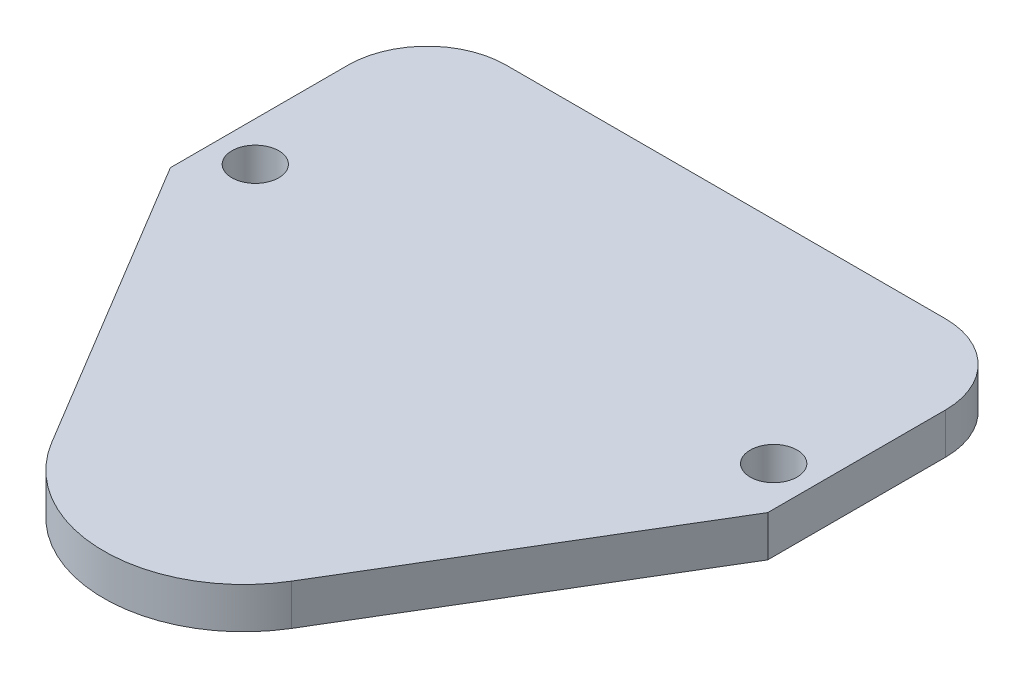
ISO-10303-21;
HEADER;
FILE_DESCRIPTION(('STEP AP214'),'2;1');
FILE_NAME('part.step','',(''),(''),'','','');
FILE_SCHEMA(('AUTOMOTIVE_DESIGN { 1 0 10303 214 1 1 1 1 }'));
ENDSEC;
DATA;
#1=APPLICATION_CONTEXT('core data for automotive mechanical design processes');
#2=APPLICATION_PROTOCOL_DEFINITION('international standard','automotive_design',2000,#1);
#3=PRODUCT_CONTEXT('',#1,'mechanical');
#4=PRODUCT('Part','Part','',(#3));
#5=PRODUCT_RELATED_PRODUCT_CATEGORY('part','',(#4));
#6=PRODUCT_DEFINITION_FORMATION('','',#4);
#7=PRODUCT_DEFINITION_CONTEXT('part definition',#1,'design');
#8=PRODUCT_DEFINITION('design','',#6,#7);
#9=PRODUCT_DEFINITION_SHAPE('','',#8);
#10=(LENGTH_UNIT() NAMED_UNIT(*) SI_UNIT(.MILLI.,.METRE.));
#11=(NAMED_UNIT(*) PLANE_ANGLE_UNIT() SI_UNIT($,.RADIAN.));
#12=(NAMED_UNIT(*) SI_UNIT($,.STERADIAN.) SOLID_ANGLE_UNIT());
#13=UNCERTAINTY_MEASURE_WITH_UNIT(LENGTH_MEASURE(1.E-05),#10,'distance_accuracy_value','');
#14=(GEOMETRIC_REPRESENTATION_CONTEXT(3) GLOBAL_UNCERTAINTY_ASSIGNED_CONTEXT((#13)) GLOBAL_UNIT_ASSIGNED_CONTEXT((#10,
#11,#12)) REPRESENTATION_CONTEXT('',''));
#15=CARTESIAN_POINT('',(0.,0.,0.));
#16=DIRECTION('',(0.,0.,1.));
#17=DIRECTION('',(1.,0.,0.));
#18=AXIS2_PLACEMENT_3D('',#15,#16,#17);
#19=CARTESIAN_POINT('',(0.,4.15,17.3279553115594));
#20=DIRECTION('',(0.,1.,0.));
#21=DIRECTION('',(0.,0.,1.));
#22=AXIS2_PLACEMENT_3D('',#19,#20,#21);
#23=PLANE('',#22);
#24=CARTESIAN_POINT('',(26.25,4.15,-10.1));
#25=DIRECTION('',(0.,1.,0.));
#26=DIRECTION('',(0.,0.,1.));
#27=AXIS2_PLACEMENT_3D('',#24,#25,#26);
#28=CIRCLE('',#27,2.375);
#29=CARTESIAN_POINT('',(26.25,4.15,-12.475));
#30=VERTEX_POINT('',#29);
#31=EDGE_CURVE('E137',#30,#30,#28,.T.);
#32=ORIENTED_EDGE('',*,*,#31,.F.);
#33=EDGE_LOOP('',(#32));
#34=FACE_BOUND('',#33,.T.);
#35=CARTESIAN_POINT('',(0.,4.15,17.3279553115594));
#36=DIRECTION('',(0.,1.,0.));
#37=DIRECTION('',(0.,0.,1.));
#38=AXIS2_PLACEMENT_3D('',#35,#36,#37);
#39=CIRCLE('',#38,14.1720446884405);
#40=CARTESIAN_POINT('',(-12.1478132910203,4.15,24.6270979254331));
#41=VERTEX_POINT('',#40);
#42=CARTESIAN_POINT('',(12.1478132910203,4.15,24.6270979254331));
#43=VERTEX_POINT('',#42);
#44=EDGE_CURVE('E148',#41,#43,#39,.T.);
#45=ORIENTED_EDGE('',*,*,#44,.T.);
#46=DIRECTION('',(0.515038074910055,0.,-0.857167300702112));
#47=VECTOR('',#46,1.);
#48=CARTESIAN_POINT('',(30.25,4.15,-5.5));
#49=LINE('',#48,#47);
#50=CARTESIAN_POINT('',(30.25,4.15,-5.5));
#51=VERTEX_POINT('',#50);
#52=EDGE_CURVE('E96',#43,#51,#49,.T.);
#53=ORIENTED_EDGE('',*,*,#52,.T.);
#54=DIRECTION('',(0.,0.,-1.));
#55=VECTOR('',#54,1.);
#56=CARTESIAN_POINT('',(30.25,4.15,-23.4999999999999));
#57=LINE('',#56,#55);
#58=CARTESIAN_POINT('',(30.25,4.15,-23.4999999999999));
#59=VERTEX_POINT('',#58);
#60=EDGE_CURVE('E163',#51,#59,#57,.T.);
#61=ORIENTED_EDGE('',*,*,#60,.T.);
#62=CARTESIAN_POINT('',(22.25,4.15,-23.5));
#63=DIRECTION('',(0.,1.,0.));
#64=DIRECTION('',(0.,0.,1.));
#65=AXIS2_PLACEMENT_3D('',#62,#63,#64);
#66=CIRCLE('',#65,8.);
#67=CARTESIAN_POINT('',(22.2499999999999,4.15,-31.5));
#68=VERTEX_POINT('',#67);
#69=EDGE_CURVE('E176',#59,#68,#66,.T.);
#70=ORIENTED_EDGE('',*,*,#69,.T.);
#71=DIRECTION('',(-1.,0.,0.));
#72=VECTOR('',#71,1.);
#73=CARTESIAN_POINT('',(-22.2499999999999,4.15,-31.5));
#74=LINE('',#73,#72);
#75=CARTESIAN_POINT('',(-22.25,4.15,-31.5));
#76=VERTEX_POINT('',#75);
#77=EDGE_CURVE('E115',#68,#76,#74,.T.);
#78=ORIENTED_EDGE('',*,*,#77,.T.);
#79=CARTESIAN_POINT('',(-22.25,4.15,-23.5));
#80=DIRECTION('',(0.,1.,0.));
#81=DIRECTION('',(0.,0.,-1.));
#82=AXIS2_PLACEMENT_3D('',#79,#80,#81);
#83=CIRCLE('',#82,8.);
#84=CARTESIAN_POINT('',(-30.25,4.15,-23.4999999999999));
#85=VERTEX_POINT('',#84);
#86=EDGE_CURVE('E109',#76,#85,#83,.T.);
#87=ORIENTED_EDGE('',*,*,#86,.T.);
#88=DIRECTION('',(0.,0.,1.));
#89=VECTOR('',#88,1.);
#90=CARTESIAN_POINT('',(-30.25,4.15,-23.4999999999999));
#91=LINE('',#90,#89);
#92=CARTESIAN_POINT('',(-30.25,4.15,-5.5));
#93=VERTEX_POINT('',#92);
#94=EDGE_CURVE('E113',#85,#93,#91,.T.);
#95=ORIENTED_EDGE('',*,*,#94,.T.);
#96=DIRECTION('',(0.515038074910055,0.,0.857167300702112));
#97=VECTOR('',#96,1.);
#98=CARTESIAN_POINT('',(-30.25,4.15,-5.5));
#99=LINE('',#98,#97);
#100=EDGE_CURVE('E53',#93,#41,#99,.T.);
#101=ORIENTED_EDGE('',*,*,#100,.T.);
#102=EDGE_LOOP('',(#45,#53,#61,#70,#78,#87,#95,#101));
#103=FACE_BOUND('',#102,.T.);
#104=CARTESIAN_POINT('',(-26.25,4.15,-10.1));
#105=DIRECTION('',(0.,1.,0.));
#106=DIRECTION('',(0.,0.,-1.));
#107=AXIS2_PLACEMENT_3D('',#104,#105,#106);
#108=CIRCLE('',#107,2.375);
#109=CARTESIAN_POINT('',(-26.25,4.15,-12.475));
#110=VERTEX_POINT('',#109);
#111=EDGE_CURVE('E185',#110,#110,#108,.T.);
#112=ORIENTED_EDGE('',*,*,#111,.F.);
#113=EDGE_LOOP('',(#112));
#114=FACE_BOUND('',#113,.T.);
#115=ADVANCED_FACE('F36',(#34,#103,#114),#23,.T.);
#116=CARTESIAN_POINT('',(0.,0.,17.3279553115594));
#117=DIRECTION('',(0.,1.,0.));
#118=DIRECTION('',(0.,0.,1.));
#119=AXIS2_PLACEMENT_3D('',#116,#117,#118);
#120=PLANE('',#119);
#121=CARTESIAN_POINT('',(0.,0.,17.3279553115594));
#122=DIRECTION('',(0.,1.,0.));
#123=DIRECTION('',(0.,0.,1.));
#124=AXIS2_PLACEMENT_3D('',#121,#122,#123);
#125=CIRCLE('',#124,14.1720446884405);
#126=CARTESIAN_POINT('',(-12.1478132910203,0.,24.6270979254331));
#127=VERTEX_POINT('',#126);
#128=CARTESIAN_POINT('',(12.1478132910203,0.,24.6270979254331));
#129=VERTEX_POINT('',#128);
#130=EDGE_CURVE('E133',#127,#129,#125,.T.);
#131=ORIENTED_EDGE('',*,*,#130,.F.);
#132=DIRECTION('',(0.515038074910055,0.,0.857167300702112));
#133=VECTOR('',#132,1.);
#134=CARTESIAN_POINT('',(-30.25,0.,-5.5));
#135=LINE('',#134,#133);
#136=CARTESIAN_POINT('',(-30.25,0.,-5.5));
#137=VERTEX_POINT('',#136);
#138=EDGE_CURVE('E88',#137,#127,#135,.T.);
#139=ORIENTED_EDGE('',*,*,#138,.F.);
#140=DIRECTION('',(0.,0.,1.));
#141=VECTOR('',#140,1.);
#142=CARTESIAN_POINT('',(-30.25,0.,-23.4999999999999));
#143=LINE('',#142,#141);
#144=CARTESIAN_POINT('',(-30.25,0.,-23.4999999999999));
#145=VERTEX_POINT('',#144);
#146=EDGE_CURVE('E82',#145,#137,#143,.T.);
#147=ORIENTED_EDGE('',*,*,#146,.F.);
#148=CARTESIAN_POINT('',(-22.25,0.,-23.5));
#149=DIRECTION('',(0.,1.,0.));
#150=DIRECTION('',(0.,0.,-1.));
#151=AXIS2_PLACEMENT_3D('',#148,#149,#150);
#152=CIRCLE('',#151,8.);
#153=CARTESIAN_POINT('',(-22.25,0.,-31.5));
#154=VERTEX_POINT('',#153);
#155=EDGE_CURVE('E123',#154,#145,#152,.T.);
#156=ORIENTED_EDGE('',*,*,#155,.F.);
#157=DIRECTION('',(-1.,0.,0.));
#158=VECTOR('',#157,1.);
#159=CARTESIAN_POINT('',(-22.2499999999999,0.,-31.5));
#160=LINE('',#159,#158);
#161=CARTESIAN_POINT('',(22.2499999999999,0.,-31.5));
#162=VERTEX_POINT('',#161);
#163=EDGE_CURVE('E143',#162,#154,#160,.T.);
#164=ORIENTED_EDGE('',*,*,#163,.F.);
#165=CARTESIAN_POINT('',(22.25,0.,-23.5));
#166=DIRECTION('',(0.,1.,0.));
#167=DIRECTION('',(0.,0.,1.));
#168=AXIS2_PLACEMENT_3D('',#165,#166,#167);
#169=CIRCLE('',#168,8.);
#170=CARTESIAN_POINT('',(30.25,0.,-23.4999999999999));
#171=VERTEX_POINT('',#170);
#172=EDGE_CURVE('E141',#171,#162,#169,.T.);
#173=ORIENTED_EDGE('',*,*,#172,.F.);
#174=DIRECTION('',(0.,0.,-1.));
#175=VECTOR('',#174,1.);
#176=CARTESIAN_POINT('',(30.25,0.,-23.4999999999999));
#177=LINE('',#176,#175);
#178=CARTESIAN_POINT('',(30.25,0.,-5.5));
#179=VERTEX_POINT('',#178);
#180=EDGE_CURVE('E139',#179,#171,#177,.T.);
#181=ORIENTED_EDGE('',*,*,#180,.F.);
#182=DIRECTION('',(0.515038074910055,0.,-0.857167300702112));
#183=VECTOR('',#182,1.);
#184=CARTESIAN_POINT('',(30.25,0.,-5.5));
#185=LINE('',#184,#183);
#186=EDGE_CURVE('E136',#129,#179,#185,.T.);
#187=ORIENTED_EDGE('',*,*,#186,.F.);
#188=EDGE_LOOP('',(#131,#139,#147,#156,#164,#173,#181,#187));
#189=FACE_BOUND('',#188,.T.);
#190=CARTESIAN_POINT('',(26.25,0.,-10.1));
#191=DIRECTION('',(0.,1.,0.));
#192=DIRECTION('',(0.,0.,1.));
#193=AXIS2_PLACEMENT_3D('',#190,#191,#192);
#194=CIRCLE('',#193,2.375);
#195=CARTESIAN_POINT('',(26.25,0.,-12.475));
#196=VERTEX_POINT('',#195);
#197=EDGE_CURVE('E182',#196,#196,#194,.T.);
#198=ORIENTED_EDGE('',*,*,#197,.T.);
#199=EDGE_LOOP('',(#198));
#200=FACE_BOUND('',#199,.T.);
#201=CARTESIAN_POINT('',(-26.25,0.,-10.1));
#202=DIRECTION('',(0.,1.,0.));
#203=DIRECTION('',(0.,0.,-1.));
#204=AXIS2_PLACEMENT_3D('',#201,#202,#203);
#205=CIRCLE('',#204,2.375);
#206=CARTESIAN_POINT('',(-26.25,0.,-12.475));
#207=VERTEX_POINT('',#206);
#208=EDGE_CURVE('E188',#207,#207,#205,.T.);
#209=ORIENTED_EDGE('',*,*,#208,.T.);
#210=EDGE_LOOP('',(#209));
#211=FACE_BOUND('',#210,.T.);
#212=ADVANCED_FACE('F167',(#189,#200,#211),#120,.F.);
#213=CARTESIAN_POINT('',(0.,4.15,17.3279553115594));
#214=DIRECTION('',(0.,-1.,0.));
#215=DIRECTION('',(0.,0.,-1.));
#216=AXIS2_PLACEMENT_3D('',#213,#214,#215);
#217=CYLINDRICAL_SURFACE('',#216,14.1720446884405);
#218=ORIENTED_EDGE('',*,*,#130,.T.);
#219=DIRECTION('',(0.,-1.,0.));
#220=VECTOR('',#219,1.);
#221=CARTESIAN_POINT('',(12.1478132910203,4.15,24.6270979254331));
#222=LINE('',#221,#220);
#223=EDGE_CURVE('E11',#43,#129,#222,.T.);
#224=ORIENTED_EDGE('',*,*,#223,.F.);
#225=ORIENTED_EDGE('',*,*,#44,.F.);
#226=DIRECTION('',(0.,-1.,0.));
#227=VECTOR('',#226,1.);
#228=CARTESIAN_POINT('',(-12.1478132910203,4.15,24.6270979254331));
#229=LINE('',#228,#227);
#230=EDGE_CURVE('E129',#41,#127,#229,.T.);
#231=ORIENTED_EDGE('',*,*,#230,.T.);
#232=EDGE_LOOP('',(#218,#224,#225,#231));
#233=FACE_BOUND('',#232,.T.);
#234=ADVANCED_FACE('F38',(#233),#217,.T.);
#235=CARTESIAN_POINT('',(30.25,4.15,-5.5));
#236=DIRECTION('',(-0.857167300702112,0.,-0.515038074910055));
#237=DIRECTION('',(-0.515038074910055,0.,0.857167300702112));
#238=AXIS2_PLACEMENT_3D('',#235,#236,#237);
#239=PLANE('',#238);
#240=ORIENTED_EDGE('',*,*,#186,.T.);
#241=DIRECTION('',(0.,-1.,0.));
#242=VECTOR('',#241,1.);
#243=CARTESIAN_POINT('',(30.25,4.15,-5.5));
#244=LINE('',#243,#242);
#245=EDGE_CURVE('E45',#51,#179,#244,.T.);
#246=ORIENTED_EDGE('',*,*,#245,.F.);
#247=ORIENTED_EDGE('',*,*,#52,.F.);
#248=ORIENTED_EDGE('',*,*,#223,.T.);
#249=EDGE_LOOP('',(#240,#246,#247,#248));
#250=FACE_BOUND('',#249,.T.);
#251=ADVANCED_FACE('F220',(#250),#239,.F.);
#252=CARTESIAN_POINT('',(30.25,4.15,-23.4999999999999));
#253=DIRECTION('',(-1.,0.,0.));
#254=DIRECTION('',(0.,0.,1.));
#255=AXIS2_PLACEMENT_3D('',#252,#253,#254);
#256=PLANE('',#255);
#257=ORIENTED_EDGE('',*,*,#180,.T.);
#258=DIRECTION('',(0.,-1.,0.));
#259=VECTOR('',#258,1.);
#260=CARTESIAN_POINT('',(30.25,4.15,-23.4999999999999));
#261=LINE('',#260,#259);
#262=EDGE_CURVE('E155',#59,#171,#261,.T.);
#263=ORIENTED_EDGE('',*,*,#262,.F.);
#264=ORIENTED_EDGE('',*,*,#60,.F.);
#265=ORIENTED_EDGE('',*,*,#245,.T.);
#266=EDGE_LOOP('',(#257,#263,#264,#265));
#267=FACE_BOUND('',#266,.T.);
#268=ADVANCED_FACE('F161',(#267),#256,.F.);
#269=CARTESIAN_POINT('',(22.25,4.15,-23.5));
#270=DIRECTION('',(0.,-1.,0.));
#271=DIRECTION('',(0.,0.,-1.));
#272=AXIS2_PLACEMENT_3D('',#269,#270,#271);
#273=CYLINDRICAL_SURFACE('',#272,8.);
#274=ORIENTED_EDGE('',*,*,#172,.T.);
#275=DIRECTION('',(0.,-1.,0.));
#276=VECTOR('',#275,1.);
#277=CARTESIAN_POINT('',(22.2499999999999,4.15,-31.5));
#278=LINE('',#277,#276);
#279=EDGE_CURVE('E152',#68,#162,#278,.T.);
#280=ORIENTED_EDGE('',*,*,#279,.F.);
#281=ORIENTED_EDGE('',*,*,#69,.F.);
#282=ORIENTED_EDGE('',*,*,#262,.T.);
#283=EDGE_LOOP('',(#274,#280,#281,#282));
#284=FACE_BOUND('',#283,.T.);
#285=ADVANCED_FACE('F172',(#284),#273,.T.);
#286=CARTESIAN_POINT('',(-22.2499999999999,4.15,-31.5));
#287=DIRECTION('',(0.,0.,1.));
#288=DIRECTION('',(1.,0.,0.));
#289=AXIS2_PLACEMENT_3D('',#286,#287,#288);
#290=PLANE('',#289);
#291=ORIENTED_EDGE('',*,*,#163,.T.);
#292=DIRECTION('',(0.,-1.,0.));
#293=VECTOR('',#292,1.);
#294=CARTESIAN_POINT('',(-22.25,4.15,-31.5));
#295=LINE('',#294,#293);
#296=EDGE_CURVE('E124',#76,#154,#295,.T.);
#297=ORIENTED_EDGE('',*,*,#296,.F.);
#298=ORIENTED_EDGE('',*,*,#77,.F.);
#299=ORIENTED_EDGE('',*,*,#279,.T.);
#300=EDGE_LOOP('',(#291,#297,#298,#299));
#301=FACE_BOUND('',#300,.T.);
#302=ADVANCED_FACE('F175',(#301),#290,.F.);
#303=CARTESIAN_POINT('',(-22.25,4.15,-23.5));
#304=DIRECTION('',(0.,-1.,0.));
#305=DIRECTION('',(0.,0.,-1.));
#306=AXIS2_PLACEMENT_3D('',#303,#304,#305);
#307=CYLINDRICAL_SURFACE('',#306,8.);
#308=ORIENTED_EDGE('',*,*,#155,.T.);
#309=DIRECTION('',(0.,-1.,0.));
#310=VECTOR('',#309,1.);
#311=CARTESIAN_POINT('',(-30.25,4.15,-23.4999999999999));
#312=LINE('',#311,#310);
#313=EDGE_CURVE('E120',#85,#145,#312,.T.);
#314=ORIENTED_EDGE('',*,*,#313,.F.);
#315=ORIENTED_EDGE('',*,*,#86,.F.);
#316=ORIENTED_EDGE('',*,*,#296,.T.);
#317=EDGE_LOOP('',(#308,#314,#315,#316));
#318=FACE_BOUND('',#317,.T.);
#319=ADVANCED_FACE('F121',(#318),#307,.T.);
#320=CARTESIAN_POINT('',(-30.25,4.15,-23.4999999999999));
#321=DIRECTION('',(1.,0.,0.));
#322=DIRECTION('',(0.,0.,-1.));
#323=AXIS2_PLACEMENT_3D('',#320,#321,#322);
#324=PLANE('',#323);
#325=ORIENTED_EDGE('',*,*,#146,.T.);
#326=DIRECTION('',(0.,-1.,0.));
#327=VECTOR('',#326,1.);
#328=CARTESIAN_POINT('',(-30.25,4.15,-5.5));
#329=LINE('',#328,#327);
#330=EDGE_CURVE('E125',#93,#137,#329,.T.);
#331=ORIENTED_EDGE('',*,*,#330,.F.);
#332=ORIENTED_EDGE('',*,*,#94,.F.);
#333=ORIENTED_EDGE('',*,*,#313,.T.);
#334=EDGE_LOOP('',(#325,#331,#332,#333));
#335=FACE_BOUND('',#334,.T.);
#336=ADVANCED_FACE('F127',(#335),#324,.F.);
#337=CARTESIAN_POINT('',(-30.25,4.15,-5.5));
#338=DIRECTION('',(0.857167300702112,0.,-0.515038074910055));
#339=DIRECTION('',(-0.515038074910055,0.,-0.857167300702112));
#340=AXIS2_PLACEMENT_3D('',#337,#338,#339);
#341=PLANE('',#340);
#342=ORIENTED_EDGE('',*,*,#138,.T.);
#343=ORIENTED_EDGE('',*,*,#230,.F.);
#344=ORIENTED_EDGE('',*,*,#100,.F.);
#345=ORIENTED_EDGE('',*,*,#330,.T.);
#346=EDGE_LOOP('',(#342,#343,#344,#345));
#347=FACE_BOUND('',#346,.T.);
#348=ADVANCED_FACE('F208',(#347),#341,.F.);
#349=CARTESIAN_POINT('',(26.25,4.15,-10.1));
#350=DIRECTION('',(0.,-1.,0.));
#351=DIRECTION('',(0.,0.,-1.));
#352=AXIS2_PLACEMENT_3D('',#349,#350,#351);
#353=CYLINDRICAL_SURFACE('',#352,2.375);
#354=CARTESIAN_POINT('',(26.25,4.15,-12.475));
#355=CARTESIAN_POINT('',(26.25,4.10677083333333,-12.475));
#356=CARTESIAN_POINT('',(26.25,4.06354166666667,-12.475));
#357=CARTESIAN_POINT('',(26.25,3.97708333333333,-12.475));
#358=CARTESIAN_POINT('',(26.25,3.93385416666667,-12.475));
#359=CARTESIAN_POINT('',(26.25,3.84739583333333,-12.475));
#360=CARTESIAN_POINT('',(26.25,3.80416666666667,-12.475));
#361=CARTESIAN_POINT('',(26.25,3.71770833333333,-12.475));
#362=CARTESIAN_POINT('',(26.25,3.67447916666667,-12.475));
#363=CARTESIAN_POINT('',(26.25,3.58802083333333,-12.475));
#364=CARTESIAN_POINT('',(26.25,3.54479166666667,-12.475));
#365=CARTESIAN_POINT('',(26.25,3.45833333333333,-12.475));
#366=CARTESIAN_POINT('',(26.25,3.41510416666667,-12.475));
#367=CARTESIAN_POINT('',(26.25,3.32864583333333,-12.475));
#368=CARTESIAN_POINT('',(26.25,3.28541666666667,-12.475));
#369=CARTESIAN_POINT('',(26.25,3.19895833333333,-12.475));
#370=CARTESIAN_POINT('',(26.25,3.15572916666667,-12.475));
#371=CARTESIAN_POINT('',(26.25,3.06927083333333,-12.475));
#372=CARTESIAN_POINT('',(26.25,3.02604166666667,-12.475));
#373=CARTESIAN_POINT('',(26.25,2.93958333333333,-12.475));
#374=CARTESIAN_POINT('',(26.25,2.89635416666667,-12.475));
#375=CARTESIAN_POINT('',(26.25,2.80989583333333,-12.475));
#376=CARTESIAN_POINT('',(26.25,2.76666666666667,-12.475));
#377=CARTESIAN_POINT('',(26.25,2.68020833333333,-12.475));
#378=CARTESIAN_POINT('',(26.25,2.63697916666667,-12.475));
#379=CARTESIAN_POINT('',(26.25,2.55052083333333,-12.475));
#380=CARTESIAN_POINT('',(26.25,2.50729166666667,-12.475));
#381=CARTESIAN_POINT('',(26.25,2.42083333333333,-12.475));
#382=CARTESIAN_POINT('',(26.25,2.37760416666667,-12.475));
#383=CARTESIAN_POINT('',(26.25,2.29114583333333,-12.475));
#384=CARTESIAN_POINT('',(26.25,2.24791666666667,-12.475));
#385=CARTESIAN_POINT('',(26.25,2.16145833333333,-12.475));
#386=CARTESIAN_POINT('',(26.25,2.11822916666667,-12.475));
#387=CARTESIAN_POINT('',(26.25,2.03177083333333,-12.475));
#388=CARTESIAN_POINT('',(26.25,1.98854166666667,-12.475));
#389=CARTESIAN_POINT('',(26.25,1.90208333333333,-12.475));
#390=CARTESIAN_POINT('',(26.25,1.85885416666667,-12.475));
#391=CARTESIAN_POINT('',(26.25,1.77239583333333,-12.475));
#392=CARTESIAN_POINT('',(26.25,1.72916666666667,-12.475));
#393=CARTESIAN_POINT('',(26.25,1.64270833333333,-12.475));
#394=CARTESIAN_POINT('',(26.25,1.59947916666667,-12.475));
#395=CARTESIAN_POINT('',(26.25,1.51302083333333,-12.475));
#396=CARTESIAN_POINT('',(26.25,1.46979166666667,-12.475));
#397=CARTESIAN_POINT('',(26.25,1.38333333333333,-12.475));
#398=CARTESIAN_POINT('',(26.25,1.34010416666667,-12.475));
#399=CARTESIAN_POINT('',(26.25,1.25364583333333,-12.475));
#400=CARTESIAN_POINT('',(26.25,1.21041666666667,-12.475));
#401=CARTESIAN_POINT('',(26.25,1.12395833333333,-12.475));
#402=CARTESIAN_POINT('',(26.25,1.08072916666667,-12.475));
#403=CARTESIAN_POINT('',(26.25,0.994270833333334,-12.475));
#404=CARTESIAN_POINT('',(26.25,0.951041666666667,-12.475));
#405=CARTESIAN_POINT('',(26.25,0.864583333333333,-12.475));
#406=CARTESIAN_POINT('',(26.25,0.821354166666667,-12.475));
#407=CARTESIAN_POINT('',(26.25,0.734895833333334,-12.475));
#408=CARTESIAN_POINT('',(26.25,0.691666666666667,-12.475));
#409=CARTESIAN_POINT('',(26.25,0.605208333333333,-12.475));
#410=CARTESIAN_POINT('',(26.25,0.561979166666667,-12.475));
#411=CARTESIAN_POINT('',(26.25,0.475520833333333,-12.475));
#412=CARTESIAN_POINT('',(26.25,0.432291666666667,-12.475));
#413=CARTESIAN_POINT('',(26.25,0.345833333333333,-12.475));
#414=CARTESIAN_POINT('',(26.25,0.302604166666667,-12.475));
#415=CARTESIAN_POINT('',(26.25,0.216145833333333,-12.475));
#416=CARTESIAN_POINT('',(26.25,0.172916666666666,-12.475));
#417=CARTESIAN_POINT('',(26.25,0.0864583333333331,-12.475));
#418=CARTESIAN_POINT('',(26.25,0.0432291666666665,-12.475));
#419=CARTESIAN_POINT('',(26.25,0.,-12.475));
#420=B_SPLINE_CURVE_WITH_KNOTS('',3,(#354,#355,#356,#357,#358,#359,#360,#361,#362,#363,#364,
#365,#366,#367,#368,#369,#370,#371,#372,#373,#374,#375,#376,#377,#378,#379,#380,#381,#382,#383,
#384,#385,#386,#387,#388,#389,#390,#391,#392,#393,#394,#395,#396,#397,#398,#399,#400,#401,#402,
#403,#404,#405,#406,#407,#408,#409,#410,#411,#412,#413,#414,#415,#416,#417,#418,#419),
.UNSPECIFIED.,.F.,.F.,(4,2,2,2,2,2,2,2,2,2,2,2,2,2,2,2,2,2,2,2,2,2,2,2,2,2,2,2,2,2,2,2,4),(0.,
0.1296875,0.259375,0.3890625,0.518749999999999,0.6484375,0.778124999999999,0.907812499999999,
1.0375,1.1671875,1.296875,1.4265625,1.55625,1.6859375,1.815625,1.9453125,2.075,2.2046875,
2.334375,2.4640625,2.59375,2.7234375,2.853125,2.9828125,3.1125,3.2421875,3.371875,3.5015625,
3.63125,3.7609375,3.890625,4.0203125,4.15),.UNSPECIFIED.);
#421=EDGE_CURVE('BSEAM205',#30,#196,#420,.T.);
#422=ORIENTED_EDGE('',*,*,#31,.T.);
#423=ORIENTED_EDGE('',*,*,#197,.F.);
#424=ORIENTED_EDGE('',*,*,#421,.T.);
#425=ORIENTED_EDGE('',*,*,#421,.F.);
#426=EDGE_LOOP('',(#422,#424,#423,#425));
#427=FACE_BOUND('',#426,.T.);
#428=ADVANCED_FACE('F205',(#427),#353,.F.);
#429=CARTESIAN_POINT('',(-26.25,4.15,-10.1));
#430=DIRECTION('',(0.,-1.,0.));
#431=DIRECTION('',(0.,0.,-1.));
#432=AXIS2_PLACEMENT_3D('',#429,#430,#431);
#433=CYLINDRICAL_SURFACE('',#432,2.375);
#434=CARTESIAN_POINT('',(-26.25,4.15,-12.475));
#435=CARTESIAN_POINT('',(-26.25,4.10677083333333,-12.475));
#436=CARTESIAN_POINT('',(-26.25,4.06354166666667,-12.475));
#437=CARTESIAN_POINT('',(-26.25,3.97708333333333,-12.475));
#438=CARTESIAN_POINT('',(-26.25,3.93385416666667,-12.475));
#439=CARTESIAN_POINT('',(-26.25,3.84739583333333,-12.475));
#440=CARTESIAN_POINT('',(-26.25,3.80416666666667,-12.475));
#441=CARTESIAN_POINT('',(-26.25,3.71770833333333,-12.475));
#442=CARTESIAN_POINT('',(-26.25,3.67447916666667,-12.475));
#443=CARTESIAN_POINT('',(-26.25,3.58802083333333,-12.475));
#444=CARTESIAN_POINT('',(-26.25,3.54479166666667,-12.475));
#445=CARTESIAN_POINT('',(-26.25,3.45833333333333,-12.475));
#446=CARTESIAN_POINT('',(-26.25,3.41510416666667,-12.475));
#447=CARTESIAN_POINT('',(-26.25,3.32864583333333,-12.475));
#448=CARTESIAN_POINT('',(-26.25,3.28541666666667,-12.475));
#449=CARTESIAN_POINT('',(-26.25,3.19895833333333,-12.475));
#450=CARTESIAN_POINT('',(-26.25,3.15572916666667,-12.475));
#451=CARTESIAN_POINT('',(-26.25,3.06927083333333,-12.475));
#452=CARTESIAN_POINT('',(-26.25,3.02604166666667,-12.475));
#453=CARTESIAN_POINT('',(-26.25,2.93958333333333,-12.475));
#454=CARTESIAN_POINT('',(-26.25,2.89635416666667,-12.475));
#455=CARTESIAN_POINT('',(-26.25,2.80989583333333,-12.475));
#456=CARTESIAN_POINT('',(-26.25,2.76666666666667,-12.475));
#457=CARTESIAN_POINT('',(-26.25,2.68020833333333,-12.475));
#458=CARTESIAN_POINT('',(-26.25,2.63697916666667,-12.475));
#459=CARTESIAN_POINT('',(-26.25,2.55052083333333,-12.475));
#460=CARTESIAN_POINT('',(-26.25,2.50729166666667,-12.475));
#461=CARTESIAN_POINT('',(-26.25,2.42083333333333,-12.475));
#462=CARTESIAN_POINT('',(-26.25,2.37760416666667,-12.475));
#463=CARTESIAN_POINT('',(-26.25,2.29114583333333,-12.475));
#464=CARTESIAN_POINT('',(-26.25,2.24791666666667,-12.475));
#465=CARTESIAN_POINT('',(-26.25,2.16145833333333,-12.475));
#466=CARTESIAN_POINT('',(-26.25,2.11822916666667,-12.475));
#467=CARTESIAN_POINT('',(-26.25,2.03177083333333,-12.475));
#468=CARTESIAN_POINT('',(-26.25,1.98854166666667,-12.475));
#469=CARTESIAN_POINT('',(-26.25,1.90208333333333,-12.475));
#470=CARTESIAN_POINT('',(-26.25,1.85885416666667,-12.475));
#471=CARTESIAN_POINT('',(-26.25,1.77239583333333,-12.475));
#472=CARTESIAN_POINT('',(-26.25,1.72916666666667,-12.475));
#473=CARTESIAN_POINT('',(-26.25,1.64270833333333,-12.475));
#474=CARTESIAN_POINT('',(-26.25,1.59947916666667,-12.475));
#475=CARTESIAN_POINT('',(-26.25,1.51302083333333,-12.475));
#476=CARTESIAN_POINT('',(-26.25,1.46979166666667,-12.475));
#477=CARTESIAN_POINT('',(-26.25,1.38333333333333,-12.475));
#478=CARTESIAN_POINT('',(-26.25,1.34010416666667,-12.475));
#479=CARTESIAN_POINT('',(-26.25,1.25364583333333,-12.475));
#480=CARTESIAN_POINT('',(-26.25,1.21041666666667,-12.475));
#481=CARTESIAN_POINT('',(-26.25,1.12395833333333,-12.475));
#482=CARTESIAN_POINT('',(-26.25,1.08072916666667,-12.475));
#483=CARTESIAN_POINT('',(-26.25,0.994270833333334,-12.475));
#484=CARTESIAN_POINT('',(-26.25,0.951041666666667,-12.475));
#485=CARTESIAN_POINT('',(-26.25,0.864583333333333,-12.475));
#486=CARTESIAN_POINT('',(-26.25,0.821354166666667,-12.475));
#487=CARTESIAN_POINT('',(-26.25,0.734895833333334,-12.475));
#488=CARTESIAN_POINT('',(-26.25,0.691666666666667,-12.475));
#489=CARTESIAN_POINT('',(-26.25,0.605208333333333,-12.475));
#490=CARTESIAN_POINT('',(-26.25,0.561979166666667,-12.475));
#491=CARTESIAN_POINT('',(-26.25,0.475520833333333,-12.475));
#492=CARTESIAN_POINT('',(-26.25,0.432291666666667,-12.475));
#493=CARTESIAN_POINT('',(-26.25,0.345833333333333,-12.475));
#494=CARTESIAN_POINT('',(-26.25,0.302604166666667,-12.475));
#495=CARTESIAN_POINT('',(-26.25,0.216145833333333,-12.475));
#496=CARTESIAN_POINT('',(-26.25,0.172916666666666,-12.475));
#497=CARTESIAN_POINT('',(-26.25,0.0864583333333331,-12.475));
#498=CARTESIAN_POINT('',(-26.25,0.0432291666666665,-12.475));
#499=CARTESIAN_POINT('',(-26.25,0.,-12.475));
#500=B_SPLINE_CURVE_WITH_KNOTS('',3,(#434,#435,#436,#437,#438,#439,#440,#441,#442,#443,#444,
#445,#446,#447,#448,#449,#450,#451,#452,#453,#454,#455,#456,#457,#458,#459,#460,#461,#462,#463,
#464,#465,#466,#467,#468,#469,#470,#471,#472,#473,#474,#475,#476,#477,#478,#479,#480,#481,#482,
#483,#484,#485,#486,#487,#488,#489,#490,#491,#492,#493,#494,#495,#496,#497,#498,#499),
.UNSPECIFIED.,.F.,.F.,(4,2,2,2,2,2,2,2,2,2,2,2,2,2,2,2,2,2,2,2,2,2,2,2,2,2,2,2,2,2,2,2,4),(0.,
0.1296875,0.259375,0.3890625,0.518749999999999,0.6484375,0.778124999999999,0.907812499999999,
1.0375,1.1671875,1.296875,1.4265625,1.55625,1.6859375,1.815625,1.9453125,2.075,2.2046875,
2.334375,2.4640625,2.59375,2.7234375,2.853125,2.9828125,3.1125,3.2421875,3.371875,3.5015625,
3.63125,3.7609375,3.890625,4.0203125,4.15),.UNSPECIFIED.);
#501=EDGE_CURVE('BSEAM194',#110,#207,#500,.T.);
#502=ORIENTED_EDGE('',*,*,#111,.T.);
#503=ORIENTED_EDGE('',*,*,#208,.F.);
#504=ORIENTED_EDGE('',*,*,#501,.T.);
#505=ORIENTED_EDGE('',*,*,#501,.F.);
#506=EDGE_LOOP('',(#502,#504,#503,#505));
#507=FACE_BOUND('',#506,.T.);
#508=ADVANCED_FACE('F194',(#507),#433,.F.);
#509=CLOSED_SHELL('',(#115,#212,#234,#251,#268,#285,#302,#319,#336,#348,#428,#508));
#510=MANIFOLD_SOLID_BREP('B2',#509);
#511=ADVANCED_BREP_SHAPE_REPRESENTATION('',(#18,#510),#14);
#512=SHAPE_DEFINITION_REPRESENTATION(#9,#511);
ENDSEC;
END-ISO-10303-21;
